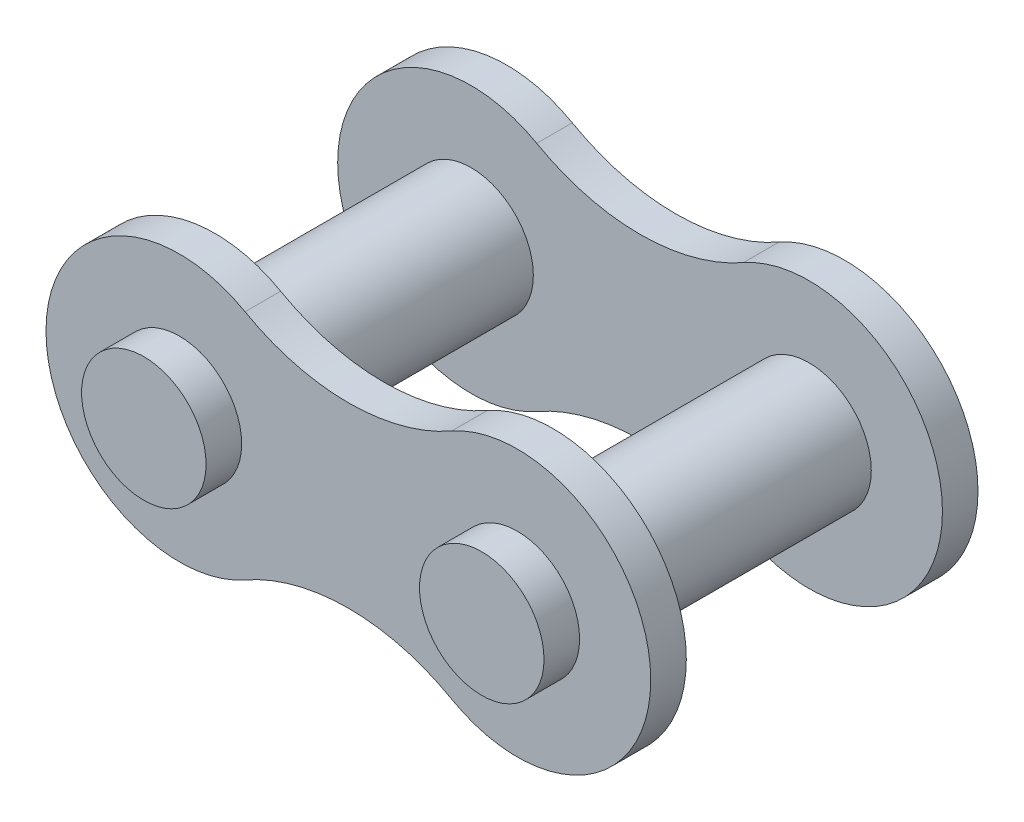
ISO-10303-21;
HEADER;
FILE_DESCRIPTION(('STEP AP214'),'2;1');
FILE_NAME('part.step','',(''),(''),'','','');
FILE_SCHEMA(('AUTOMOTIVE_DESIGN { 1 0 10303 214 1 1 1 1 }'));
ENDSEC;
DATA;
#1=APPLICATION_CONTEXT('core data for automotive mechanical design processes');
#2=APPLICATION_PROTOCOL_DEFINITION('international standard','automotive_design',2000,#1);
#3=PRODUCT_CONTEXT('',#1,'mechanical');
#4=PRODUCT('Part','Part','',(#3));
#5=PRODUCT_RELATED_PRODUCT_CATEGORY('part','',(#4));
#6=PRODUCT_DEFINITION_FORMATION('','',#4);
#7=PRODUCT_DEFINITION_CONTEXT('part definition',#1,'design');
#8=PRODUCT_DEFINITION('design','',#6,#7);
#9=PRODUCT_DEFINITION_SHAPE('','',#8);
#10=(LENGTH_UNIT() NAMED_UNIT(*) SI_UNIT(.MILLI.,.METRE.));
#11=(NAMED_UNIT(*) PLANE_ANGLE_UNIT() SI_UNIT($,.RADIAN.));
#12=(NAMED_UNIT(*) SI_UNIT($,.STERADIAN.) SOLID_ANGLE_UNIT());
#13=UNCERTAINTY_MEASURE_WITH_UNIT(LENGTH_MEASURE(1.E-05),#10,'distance_accuracy_value','');
#14=(GEOMETRIC_REPRESENTATION_CONTEXT(3) GLOBAL_UNCERTAINTY_ASSIGNED_CONTEXT((#13)) GLOBAL_UNIT_ASSIGNED_CONTEXT((#10,
#11,#12)) REPRESENTATION_CONTEXT('',''));
#15=CARTESIAN_POINT('',(0.,0.,0.));
#16=DIRECTION('',(0.,0.,1.));
#17=DIRECTION('',(1.,0.,0.));
#18=AXIS2_PLACEMENT_3D('',#15,#16,#17);
#19=CARTESIAN_POINT('',(4.75,8.4,1.));
#20=DIRECTION('',(0.,0.,-1.));
#21=DIRECTION('',(-1.,0.,0.));
#22=AXIS2_PLACEMENT_3D('',#19,#20,#21);
#23=CYLINDRICAL_SURFACE('',#22,5.9);
#24=CARTESIAN_POINT('',(4.75,8.4,0.));
#25=DIRECTION('',(0.,0.,-1.));
#26=DIRECTION('',(1.,0.,0.));
#27=AXIS2_PLACEMENT_3D('',#24,#25,#26);
#28=CIRCLE('',#27,5.9);
#29=CARTESIAN_POINT('',(7.65414507772021,3.26424870466322,0.));
#30=VERTEX_POINT('',#29);
#31=CARTESIAN_POINT('',(1.84585492227979,3.26424870466322,0.));
#32=VERTEX_POINT('',#31);
#33=EDGE_CURVE('E131',#30,#32,#28,.T.);
#34=ORIENTED_EDGE('',*,*,#33,.T.);
#35=DIRECTION('',(0.,0.,-1.));
#36=VECTOR('',#35,1.);
#37=CARTESIAN_POINT('',(1.84585492227979,3.26424870466322,1.));
#38=LINE('',#37,#36);
#39=CARTESIAN_POINT('',(1.84585492227979,3.26424870466322,1.));
#40=VERTEX_POINT('',#39);
#41=EDGE_CURVE('E152',#40,#32,#38,.T.);
#42=ORIENTED_EDGE('',*,*,#41,.F.);
#43=CARTESIAN_POINT('',(4.75,8.4,1.));
#44=DIRECTION('',(0.,0.,-1.));
#45=DIRECTION('',(1.,0.,0.));
#46=AXIS2_PLACEMENT_3D('',#43,#44,#45);
#47=CIRCLE('',#46,5.9);
#48=CARTESIAN_POINT('',(7.65414507772021,3.26424870466322,1.));
#49=VERTEX_POINT('',#48);
#50=EDGE_CURVE('E134',#49,#40,#47,.T.);
#51=ORIENTED_EDGE('',*,*,#50,.F.);
#52=DIRECTION('',(0.,0.,-1.));
#53=VECTOR('',#52,1.);
#54=CARTESIAN_POINT('',(7.65414507772021,3.26424870466322,1.));
#55=LINE('',#54,#53);
#56=EDGE_CURVE('E140',#49,#30,#55,.T.);
#57=ORIENTED_EDGE('',*,*,#56,.T.);
#58=EDGE_LOOP('',(#34,#42,#51,#57));
#59=FACE_BOUND('',#58,.T.);
#60=ADVANCED_FACE('F16',(#59),#23,.F.);
#61=CARTESIAN_POINT('',(0.,0.,1.));
#62=DIRECTION('',(0.,0.,-1.));
#63=DIRECTION('',(-1.,0.,0.));
#64=AXIS2_PLACEMENT_3D('',#61,#62,#63);
#65=CYLINDRICAL_SURFACE('',#64,3.75);
#66=CARTESIAN_POINT('',(0.,0.,0.));
#67=DIRECTION('',(0.,0.,1.));
#68=DIRECTION('',(1.,0.,0.));
#69=AXIS2_PLACEMENT_3D('',#66,#67,#68);
#70=CIRCLE('',#69,3.75);
#71=CARTESIAN_POINT('',(1.84585492227979,-3.26424870466322,0.));
#72=VERTEX_POINT('',#71);
#73=EDGE_CURVE('E143',#32,#72,#70,.T.);
#74=ORIENTED_EDGE('',*,*,#73,.T.);
#75=DIRECTION('',(0.,0.,-1.));
#76=VECTOR('',#75,1.);
#77=CARTESIAN_POINT('',(1.84585492227979,-3.26424870466322,1.));
#78=LINE('',#77,#76);
#79=CARTESIAN_POINT('',(1.84585492227979,-3.26424870466322,1.));
#80=VERTEX_POINT('',#79);
#81=EDGE_CURVE('E150',#80,#72,#78,.T.);
#82=ORIENTED_EDGE('',*,*,#81,.F.);
#83=CARTESIAN_POINT('',(0.,0.,1.));
#84=DIRECTION('',(0.,0.,1.));
#85=DIRECTION('',(1.,0.,0.));
#86=AXIS2_PLACEMENT_3D('',#83,#84,#85);
#87=CIRCLE('',#86,3.75);
#88=EDGE_CURVE('E64',#40,#80,#87,.T.);
#89=ORIENTED_EDGE('',*,*,#88,.F.);
#90=ORIENTED_EDGE('',*,*,#41,.T.);
#91=EDGE_LOOP('',(#74,#82,#89,#90));
#92=FACE_BOUND('',#91,.T.);
#93=ADVANCED_FACE('F172',(#92),#65,.T.);
#94=CARTESIAN_POINT('',(4.75,-8.4,1.));
#95=DIRECTION('',(0.,0.,-1.));
#96=DIRECTION('',(-1.,0.,0.));
#97=AXIS2_PLACEMENT_3D('',#94,#95,#96);
#98=CYLINDRICAL_SURFACE('',#97,5.9);
#99=CARTESIAN_POINT('',(4.75,-8.4,0.));
#100=DIRECTION('',(0.,0.,-1.));
#101=DIRECTION('',(-1.,0.,0.));
#102=AXIS2_PLACEMENT_3D('',#99,#100,#101);
#103=CIRCLE('',#102,5.9);
#104=CARTESIAN_POINT('',(7.65414507772021,-3.26424870466322,0.));
#105=VERTEX_POINT('',#104);
#106=EDGE_CURVE('E50',#72,#105,#103,.T.);
#107=ORIENTED_EDGE('',*,*,#106,.T.);
#108=DIRECTION('',(0.,0.,-1.));
#109=VECTOR('',#108,1.);
#110=CARTESIAN_POINT('',(7.65414507772021,-3.26424870466322,1.));
#111=LINE('',#110,#109);
#112=CARTESIAN_POINT('',(7.65414507772021,-3.26424870466322,1.));
#113=VERTEX_POINT('',#112);
#114=EDGE_CURVE('E148',#113,#105,#111,.T.);
#115=ORIENTED_EDGE('',*,*,#114,.F.);
#116=CARTESIAN_POINT('',(4.75,-8.4,1.));
#117=DIRECTION('',(0.,0.,-1.));
#118=DIRECTION('',(-1.,0.,0.));
#119=AXIS2_PLACEMENT_3D('',#116,#117,#118);
#120=CIRCLE('',#119,5.9);
#121=EDGE_CURVE('E137',#80,#113,#120,.T.);
#122=ORIENTED_EDGE('',*,*,#121,.F.);
#123=ORIENTED_EDGE('',*,*,#81,.T.);
#124=EDGE_LOOP('',(#107,#115,#122,#123));
#125=FACE_BOUND('',#124,.T.);
#126=ADVANCED_FACE('F171',(#125),#98,.F.);
#127=CARTESIAN_POINT('',(9.5,0.,1.));
#128=DIRECTION('',(0.,0.,-1.));
#129=DIRECTION('',(-1.,0.,0.));
#130=AXIS2_PLACEMENT_3D('',#127,#128,#129);
#131=CYLINDRICAL_SURFACE('',#130,3.75);
#132=CARTESIAN_POINT('',(9.5,0.,0.));
#133=DIRECTION('',(0.,0.,1.));
#134=DIRECTION('',(1.,0.,0.));
#135=AXIS2_PLACEMENT_3D('',#132,#133,#134);
#136=CIRCLE('',#135,3.75);
#137=EDGE_CURVE('E56',#105,#30,#136,.T.);
#138=ORIENTED_EDGE('',*,*,#137,.T.);
#139=ORIENTED_EDGE('',*,*,#56,.F.);
#140=CARTESIAN_POINT('',(9.5,0.,1.));
#141=DIRECTION('',(0.,0.,1.));
#142=DIRECTION('',(1.,0.,0.));
#143=AXIS2_PLACEMENT_3D('',#140,#141,#142);
#144=CIRCLE('',#143,3.75);
#145=EDGE_CURVE('E32',#113,#49,#144,.T.);
#146=ORIENTED_EDGE('',*,*,#145,.F.);
#147=ORIENTED_EDGE('',*,*,#114,.T.);
#148=EDGE_LOOP('',(#138,#139,#146,#147));
#149=FACE_BOUND('',#148,.T.);
#150=ADVANCED_FACE('F169',(#149),#131,.T.);
#151=CARTESIAN_POINT('',(7.125,4.2,1.));
#152=DIRECTION('',(0.,0.,1.));
#153=DIRECTION('',(1.,0.,0.));
#154=AXIS2_PLACEMENT_3D('',#151,#152,#153);
#155=PLANE('',#154);
#156=CARTESIAN_POINT('',(9.5,0.,1.));
#157=DIRECTION('',(0.,0.,1.));
#158=DIRECTION('',(1.,0.,0.));
#159=AXIS2_PLACEMENT_3D('',#156,#157,#158);
#160=CIRCLE('',#159,1.75);
#161=CARTESIAN_POINT('',(11.25,0.,1.));
#162=VERTEX_POINT('',#161);
#163=EDGE_CURVE('E116',#162,#162,#160,.T.);
#164=ORIENTED_EDGE('',*,*,#163,.F.);
#165=EDGE_LOOP('',(#164));
#166=FACE_BOUND('',#165,.T.);
#167=CARTESIAN_POINT('',(0.,0.,1.));
#168=DIRECTION('',(0.,0.,1.));
#169=DIRECTION('',(1.,0.,0.));
#170=AXIS2_PLACEMENT_3D('',#167,#168,#169);
#171=CIRCLE('',#170,1.75);
#172=CARTESIAN_POINT('',(1.75,0.,1.));
#173=VERTEX_POINT('',#172);
#174=EDGE_CURVE('E126',#173,#173,#171,.T.);
#175=ORIENTED_EDGE('',*,*,#174,.F.);
#176=EDGE_LOOP('',(#175));
#177=FACE_BOUND('',#176,.T.);
#178=ORIENTED_EDGE('',*,*,#50,.T.);
#179=ORIENTED_EDGE('',*,*,#88,.T.);
#180=ORIENTED_EDGE('',*,*,#121,.T.);
#181=ORIENTED_EDGE('',*,*,#145,.T.);
#182=EDGE_LOOP('',(#178,#179,#180,#181));
#183=FACE_BOUND('',#182,.T.);
#184=ADVANCED_FACE('F162',(#166,#177,#183),#155,.T.);
#185=CARTESIAN_POINT('',(7.125,4.2,0.));
#186=DIRECTION('',(0.,0.,1.));
#187=DIRECTION('',(1.,0.,0.));
#188=AXIS2_PLACEMENT_3D('',#185,#186,#187);
#189=PLANE('',#188);
#190=CARTESIAN_POINT('',(0.,0.,0.));
#191=DIRECTION('',(0.,0.,1.));
#192=DIRECTION('',(1.,0.,0.));
#193=AXIS2_PLACEMENT_3D('',#190,#191,#192);
#194=CIRCLE('',#193,1.75);
#195=CARTESIAN_POINT('',(1.75,0.,0.));
#196=VERTEX_POINT('',#195);
#197=EDGE_CURVE('E10',#196,#196,#194,.F.);
#198=ORIENTED_EDGE('',*,*,#197,.F.);
#199=EDGE_LOOP('',(#198));
#200=FACE_BOUND('',#199,.T.);
#201=CARTESIAN_POINT('',(9.5,0.,0.));
#202=DIRECTION('',(0.,0.,1.));
#203=DIRECTION('',(1.,0.,0.));
#204=AXIS2_PLACEMENT_3D('',#201,#202,#203);
#205=CIRCLE('',#204,1.75);
#206=CARTESIAN_POINT('',(11.25,0.,0.));
#207=VERTEX_POINT('',#206);
#208=EDGE_CURVE('E24',#207,#207,#205,.F.);
#209=ORIENTED_EDGE('',*,*,#208,.F.);
#210=EDGE_LOOP('',(#209));
#211=FACE_BOUND('',#210,.T.);
#212=ORIENTED_EDGE('',*,*,#33,.F.);
#213=ORIENTED_EDGE('',*,*,#137,.F.);
#214=ORIENTED_EDGE('',*,*,#106,.F.);
#215=ORIENTED_EDGE('',*,*,#73,.F.);
#216=EDGE_LOOP('',(#212,#213,#214,#215));
#217=FACE_BOUND('',#216,.T.);
#218=ADVANCED_FACE('F158',(#200,#211,#217),#189,.F.);
#219=CARTESIAN_POINT('',(0.,0.,8.2));
#220=DIRECTION('',(0.,0.,-1.));
#221=DIRECTION('',(-1.,0.,0.));
#222=AXIS2_PLACEMENT_3D('',#219,#220,#221);
#223=CYLINDRICAL_SURFACE('',#222,1.75);
#224=CARTESIAN_POINT('',(0.,0.,8.2));
#225=DIRECTION('',(0.,0.,1.));
#226=DIRECTION('',(1.,0.,0.));
#227=AXIS2_PLACEMENT_3D('',#224,#225,#226);
#228=CIRCLE('',#227,1.75);
#229=CARTESIAN_POINT('',(1.75,0.,8.2));
#230=VERTEX_POINT('',#229);
#231=EDGE_CURVE('E128',#230,#230,#228,.T.);
#232=ORIENTED_EDGE('',*,*,#231,.F.);
#233=EDGE_LOOP('',(#232));
#234=FACE_BOUND('',#233,.T.);
#235=ORIENTED_EDGE('',*,*,#174,.T.);
#236=EDGE_LOOP('',(#235));
#237=FACE_BOUND('',#236,.T.);
#238=ADVANCED_FACE('F161',(#234,#237),#223,.T.);
#239=CARTESIAN_POINT('',(9.5,0.,8.2));
#240=DIRECTION('',(0.,0.,-1.));
#241=DIRECTION('',(-1.,0.,0.));
#242=AXIS2_PLACEMENT_3D('',#239,#240,#241);
#243=CYLINDRICAL_SURFACE('',#242,1.75);
#244=CARTESIAN_POINT('',(9.5,0.,8.2));
#245=DIRECTION('',(0.,0.,1.));
#246=DIRECTION('',(1.,0.,0.));
#247=AXIS2_PLACEMENT_3D('',#244,#245,#246);
#248=CIRCLE('',#247,1.75);
#249=CARTESIAN_POINT('',(11.25,0.,8.2));
#250=VERTEX_POINT('',#249);
#251=EDGE_CURVE('E119',#250,#250,#248,.T.);
#252=ORIENTED_EDGE('',*,*,#251,.F.);
#253=EDGE_LOOP('',(#252));
#254=FACE_BOUND('',#253,.T.);
#255=ORIENTED_EDGE('',*,*,#163,.T.);
#256=EDGE_LOOP('',(#255));
#257=FACE_BOUND('',#256,.T.);
#258=ADVANCED_FACE('F189',(#254,#257),#243,.T.);
#259=CARTESIAN_POINT('',(0.,0.,9.2));
#260=DIRECTION('',(0.,0.,-1.));
#261=DIRECTION('',(-1.,0.,0.));
#262=AXIS2_PLACEMENT_3D('',#259,#260,#261);
#263=CYLINDRICAL_SURFACE('',#262,3.75);
#264=CARTESIAN_POINT('',(0.,0.,8.2));
#265=DIRECTION('',(0.,0.,1.));
#266=DIRECTION('',(1.,0.,0.));
#267=AXIS2_PLACEMENT_3D('',#264,#265,#266);
#268=CIRCLE('',#267,3.75);
#269=CARTESIAN_POINT('',(1.8458549222798,3.26424870466321,8.2));
#270=VERTEX_POINT('',#269);
#271=CARTESIAN_POINT('',(1.84585492227979,-3.26424870466322,8.2));
#272=VERTEX_POINT('',#271);
#273=EDGE_CURVE('E115',#270,#272,#268,.T.);
#274=ORIENTED_EDGE('',*,*,#273,.T.);
#275=DIRECTION('',(0.,0.,-1.));
#276=VECTOR('',#275,1.);
#277=CARTESIAN_POINT('',(1.84585492227979,-3.26424870466322,9.2));
#278=LINE('',#277,#276);
#279=CARTESIAN_POINT('',(1.84585492227979,-3.26424870466322,9.2));
#280=VERTEX_POINT('',#279);
#281=EDGE_CURVE('E95',#280,#272,#278,.T.);
#282=ORIENTED_EDGE('',*,*,#281,.F.);
#283=CARTESIAN_POINT('',(0.,0.,9.2));
#284=DIRECTION('',(0.,0.,1.));
#285=DIRECTION('',(1.,0.,0.));
#286=AXIS2_PLACEMENT_3D('',#283,#284,#285);
#287=CIRCLE('',#286,3.75);
#288=CARTESIAN_POINT('',(1.8458549222798,3.26424870466321,9.2));
#289=VERTEX_POINT('',#288);
#290=EDGE_CURVE('E102',#289,#280,#287,.T.);
#291=ORIENTED_EDGE('',*,*,#290,.F.);
#292=DIRECTION('',(0.,0.,-1.));
#293=VECTOR('',#292,1.);
#294=CARTESIAN_POINT('',(1.8458549222798,3.26424870466321,9.2));
#295=LINE('',#294,#293);
#296=EDGE_CURVE('E268',#289,#270,#295,.T.);
#297=ORIENTED_EDGE('',*,*,#296,.T.);
#298=EDGE_LOOP('',(#274,#282,#291,#297));
#299=FACE_BOUND('',#298,.T.);
#300=ADVANCED_FACE('F113',(#299),#263,.T.);
#301=CARTESIAN_POINT('',(4.75,-8.4,9.2));
#302=DIRECTION('',(0.,0.,-1.));
#303=DIRECTION('',(-1.,0.,0.));
#304=AXIS2_PLACEMENT_3D('',#301,#302,#303);
#305=CYLINDRICAL_SURFACE('',#304,5.9);
#306=CARTESIAN_POINT('',(4.75,-8.4,8.2));
#307=DIRECTION('',(0.,0.,-1.));
#308=DIRECTION('',(1.,0.,0.));
#309=AXIS2_PLACEMENT_3D('',#306,#307,#308);
#310=CIRCLE('',#309,5.9);
#311=CARTESIAN_POINT('',(7.65414507772021,-3.26424870466321,8.2));
#312=VERTEX_POINT('',#311);
#313=EDGE_CURVE('E270',#272,#312,#310,.T.);
#314=ORIENTED_EDGE('',*,*,#313,.T.);
#315=DIRECTION('',(0.,0.,-1.));
#316=VECTOR('',#315,1.);
#317=CARTESIAN_POINT('',(7.65414507772021,-3.26424870466321,9.2));
#318=LINE('',#317,#316);
#319=CARTESIAN_POINT('',(7.65414507772021,-3.26424870466321,9.2));
#320=VERTEX_POINT('',#319);
#321=EDGE_CURVE('E98',#320,#312,#318,.T.);
#322=ORIENTED_EDGE('',*,*,#321,.F.);
#323=CARTESIAN_POINT('',(4.75,-8.4,9.2));
#324=DIRECTION('',(0.,0.,-1.));
#325=DIRECTION('',(1.,0.,0.));
#326=AXIS2_PLACEMENT_3D('',#323,#324,#325);
#327=CIRCLE('',#326,5.9);
#328=EDGE_CURVE('E91',#280,#320,#327,.T.);
#329=ORIENTED_EDGE('',*,*,#328,.F.);
#330=ORIENTED_EDGE('',*,*,#281,.T.);
#331=EDGE_LOOP('',(#314,#322,#329,#330));
#332=FACE_BOUND('',#331,.T.);
#333=ADVANCED_FACE('F93',(#332),#305,.F.);
#334=CARTESIAN_POINT('',(9.5,0.,9.2));
#335=DIRECTION('',(0.,0.,-1.));
#336=DIRECTION('',(-1.,0.,0.));
#337=AXIS2_PLACEMENT_3D('',#334,#335,#336);
#338=CYLINDRICAL_SURFACE('',#337,3.75);
#339=CARTESIAN_POINT('',(9.5,0.,8.2));
#340=DIRECTION('',(0.,0.,1.));
#341=DIRECTION('',(1.,0.,0.));
#342=AXIS2_PLACEMENT_3D('',#339,#340,#341);
#343=CIRCLE('',#342,3.75);
#344=CARTESIAN_POINT('',(7.65414507772021,3.26424870466322,8.2));
#345=VERTEX_POINT('',#344);
#346=EDGE_CURVE('E272',#312,#345,#343,.T.);
#347=ORIENTED_EDGE('',*,*,#346,.T.);
#348=DIRECTION('',(0.,0.,-1.));
#349=VECTOR('',#348,1.);
#350=CARTESIAN_POINT('',(7.65414507772021,3.26424870466322,9.2));
#351=LINE('',#350,#349);
#352=CARTESIAN_POINT('',(7.65414507772021,3.26424870466322,9.2));
#353=VERTEX_POINT('',#352);
#354=EDGE_CURVE('E121',#353,#345,#351,.T.);
#355=ORIENTED_EDGE('',*,*,#354,.F.);
#356=CARTESIAN_POINT('',(9.5,0.,9.2));
#357=DIRECTION('',(0.,0.,1.));
#358=DIRECTION('',(1.,0.,0.));
#359=AXIS2_PLACEMENT_3D('',#356,#357,#358);
#360=CIRCLE('',#359,3.75);
#361=EDGE_CURVE('E101',#320,#353,#360,.T.);
#362=ORIENTED_EDGE('',*,*,#361,.F.);
#363=ORIENTED_EDGE('',*,*,#321,.T.);
#364=EDGE_LOOP('',(#347,#355,#362,#363));
#365=FACE_BOUND('',#364,.T.);
#366=ADVANCED_FACE('F198',(#365),#338,.T.);
#367=CARTESIAN_POINT('',(4.75,8.4,9.2));
#368=DIRECTION('',(0.,0.,-1.));
#369=DIRECTION('',(-1.,0.,0.));
#370=AXIS2_PLACEMENT_3D('',#367,#368,#369);
#371=CYLINDRICAL_SURFACE('',#370,5.9);
#372=CARTESIAN_POINT('',(4.75,8.4,8.2));
#373=DIRECTION('',(0.,0.,-1.));
#374=DIRECTION('',(1.,0.,0.));
#375=AXIS2_PLACEMENT_3D('',#372,#373,#374);
#376=CIRCLE('',#375,5.9);
#377=EDGE_CURVE('E111',#345,#270,#376,.T.);
#378=ORIENTED_EDGE('',*,*,#377,.T.);
#379=ORIENTED_EDGE('',*,*,#296,.F.);
#380=CARTESIAN_POINT('',(4.75,8.4,9.2));
#381=DIRECTION('',(0.,0.,-1.));
#382=DIRECTION('',(1.,0.,0.));
#383=AXIS2_PLACEMENT_3D('',#380,#381,#382);
#384=CIRCLE('',#383,5.9);
#385=EDGE_CURVE('E107',#353,#289,#384,.T.);
#386=ORIENTED_EDGE('',*,*,#385,.F.);
#387=ORIENTED_EDGE('',*,*,#354,.T.);
#388=EDGE_LOOP('',(#378,#379,#386,#387));
#389=FACE_BOUND('',#388,.T.);
#390=ADVANCED_FACE('F201',(#389),#371,.F.);
#391=CARTESIAN_POINT('',(2.375,-4.2,9.2));
#392=DIRECTION('',(0.,0.,1.));
#393=DIRECTION('',(1.,0.,0.));
#394=AXIS2_PLACEMENT_3D('',#391,#392,#393);
#395=PLANE('',#394);
#396=CARTESIAN_POINT('',(0.,0.,9.2));
#397=DIRECTION('',(0.,0.,1.));
#398=DIRECTION('',(1.,0.,0.));
#399=AXIS2_PLACEMENT_3D('',#396,#397,#398);
#400=CIRCLE('',#399,1.75);
#401=CARTESIAN_POINT('',(1.75,0.,9.2));
#402=VERTEX_POINT('',#401);
#403=EDGE_CURVE('E252',#402,#402,#400,.T.);
#404=ORIENTED_EDGE('',*,*,#403,.F.);
#405=EDGE_LOOP('',(#404));
#406=FACE_BOUND('',#405,.T.);
#407=CARTESIAN_POINT('',(9.5,0.,9.2));
#408=DIRECTION('',(0.,0.,1.));
#409=DIRECTION('',(1.,0.,0.));
#410=AXIS2_PLACEMENT_3D('',#407,#408,#409);
#411=CIRCLE('',#410,1.75);
#412=CARTESIAN_POINT('',(11.25,0.,9.2));
#413=VERTEX_POINT('',#412);
#414=EDGE_CURVE('E258',#413,#413,#411,.T.);
#415=ORIENTED_EDGE('',*,*,#414,.F.);
#416=EDGE_LOOP('',(#415));
#417=FACE_BOUND('',#416,.T.);
#418=ORIENTED_EDGE('',*,*,#290,.T.);
#419=ORIENTED_EDGE('',*,*,#328,.T.);
#420=ORIENTED_EDGE('',*,*,#361,.T.);
#421=ORIENTED_EDGE('',*,*,#385,.T.);
#422=EDGE_LOOP('',(#418,#419,#420,#421));
#423=FACE_BOUND('',#422,.T.);
#424=ADVANCED_FACE('F105',(#406,#417,#423),#395,.T.);
#425=CARTESIAN_POINT('',(2.375,-4.2,8.2));
#426=DIRECTION('',(0.,0.,1.));
#427=DIRECTION('',(1.,0.,0.));
#428=AXIS2_PLACEMENT_3D('',#425,#426,#427);
#429=PLANE('',#428);
#430=ORIENTED_EDGE('',*,*,#231,.T.);
#431=EDGE_LOOP('',(#430));
#432=FACE_BOUND('',#431,.T.);
#433=ORIENTED_EDGE('',*,*,#251,.T.);
#434=EDGE_LOOP('',(#433));
#435=FACE_BOUND('',#434,.T.);
#436=ORIENTED_EDGE('',*,*,#273,.F.);
#437=ORIENTED_EDGE('',*,*,#377,.F.);
#438=ORIENTED_EDGE('',*,*,#346,.F.);
#439=ORIENTED_EDGE('',*,*,#313,.F.);
#440=EDGE_LOOP('',(#436,#437,#438,#439));
#441=FACE_BOUND('',#440,.T.);
#442=ADVANCED_FACE('F206',(#432,#435,#441),#429,.F.);
#443=CARTESIAN_POINT('',(9.5,0.,10.2));
#444=DIRECTION('',(0.,0.,-1.));
#445=DIRECTION('',(-1.,0.,0.));
#446=AXIS2_PLACEMENT_3D('',#443,#444,#445);
#447=CYLINDRICAL_SURFACE('',#446,1.75);
#448=CARTESIAN_POINT('',(9.5,0.,10.2));
#449=DIRECTION('',(0.,0.,1.));
#450=DIRECTION('',(1.,0.,0.));
#451=AXIS2_PLACEMENT_3D('',#448,#449,#450);
#452=CIRCLE('',#451,1.75);
#453=CARTESIAN_POINT('',(11.25,0.,10.2));
#454=VERTEX_POINT('',#453);
#455=EDGE_CURVE('E261',#454,#454,#452,.T.);
#456=ORIENTED_EDGE('',*,*,#455,.F.);
#457=EDGE_LOOP('',(#456));
#458=FACE_BOUND('',#457,.T.);
#459=ORIENTED_EDGE('',*,*,#414,.T.);
#460=EDGE_LOOP('',(#459));
#461=FACE_BOUND('',#460,.T.);
#462=ADVANCED_FACE('F209',(#458,#461),#447,.T.);
#463=CARTESIAN_POINT('',(9.5,0.,10.2));
#464=DIRECTION('',(0.,0.,1.));
#465=DIRECTION('',(1.,0.,0.));
#466=AXIS2_PLACEMENT_3D('',#463,#464,#465);
#467=PLANE('',#466);
#468=ORIENTED_EDGE('',*,*,#455,.T.);
#469=EDGE_LOOP('',(#468));
#470=FACE_BOUND('',#469,.T.);
#471=ADVANCED_FACE('F216',(#470),#467,.T.);
#472=CARTESIAN_POINT('',(0.,0.,10.2));
#473=DIRECTION('',(0.,0.,-1.));
#474=DIRECTION('',(-1.,0.,0.));
#475=AXIS2_PLACEMENT_3D('',#472,#473,#474);
#476=CYLINDRICAL_SURFACE('',#475,1.75);
#477=CARTESIAN_POINT('',(0.,0.,10.2));
#478=DIRECTION('',(0.,0.,1.));
#479=DIRECTION('',(1.,0.,0.));
#480=AXIS2_PLACEMENT_3D('',#477,#478,#479);
#481=CIRCLE('',#480,1.75);
#482=CARTESIAN_POINT('',(1.75,0.,10.2));
#483=VERTEX_POINT('',#482);
#484=EDGE_CURVE('E255',#483,#483,#481,.T.);
#485=ORIENTED_EDGE('',*,*,#484,.F.);
#486=EDGE_LOOP('',(#485));
#487=FACE_BOUND('',#486,.T.);
#488=ORIENTED_EDGE('',*,*,#403,.T.);
#489=EDGE_LOOP('',(#488));
#490=FACE_BOUND('',#489,.T.);
#491=ADVANCED_FACE('F220',(#487,#490),#476,.T.);
#492=CARTESIAN_POINT('',(0.,0.,10.2));
#493=DIRECTION('',(0.,0.,1.));
#494=DIRECTION('',(1.,0.,0.));
#495=AXIS2_PLACEMENT_3D('',#492,#493,#494);
#496=PLANE('',#495);
#497=ORIENTED_EDGE('',*,*,#484,.T.);
#498=EDGE_LOOP('',(#497));
#499=FACE_BOUND('',#498,.T.);
#500=ADVANCED_FACE('F224',(#499),#496,.T.);
#501=CARTESIAN_POINT('',(9.5,0.,-1.));
#502=DIRECTION('',(0.,0.,1.));
#503=DIRECTION('',(1.,0.,0.));
#504=AXIS2_PLACEMENT_3D('',#501,#502,#503);
#505=CYLINDRICAL_SURFACE('',#504,1.75);
#506=CARTESIAN_POINT('',(9.5,0.,-1.));
#507=DIRECTION('',(0.,0.,-1.));
#508=DIRECTION('',(-1.,0.,0.));
#509=AXIS2_PLACEMENT_3D('',#506,#507,#508);
#510=CIRCLE('',#509,1.75);
#511=CARTESIAN_POINT('',(7.75,0.,-1.));
#512=VERTEX_POINT('',#511);
#513=EDGE_CURVE('E249',#512,#512,#510,.T.);
#514=ORIENTED_EDGE('',*,*,#513,.F.);
#515=EDGE_LOOP('',(#514));
#516=FACE_BOUND('',#515,.T.);
#517=ORIENTED_EDGE('',*,*,#208,.T.);
#518=EDGE_LOOP('',(#517));
#519=FACE_BOUND('',#518,.T.);
#520=ADVANCED_FACE('F156',(#516,#519),#505,.T.);
#521=CARTESIAN_POINT('',(9.5,0.,-1.));
#522=DIRECTION('',(0.,0.,-1.));
#523=DIRECTION('',(-1.,0.,0.));
#524=AXIS2_PLACEMENT_3D('',#521,#522,#523);
#525=PLANE('',#524);
#526=ORIENTED_EDGE('',*,*,#513,.T.);
#527=EDGE_LOOP('',(#526));
#528=FACE_BOUND('',#527,.T.);
#529=ADVANCED_FACE('F231',(#528),#525,.T.);
#530=CARTESIAN_POINT('',(0.,0.,-1.));
#531=DIRECTION('',(0.,0.,1.));
#532=DIRECTION('',(1.,0.,0.));
#533=AXIS2_PLACEMENT_3D('',#530,#531,#532);
#534=CYLINDRICAL_SURFACE('',#533,1.75);
#535=CARTESIAN_POINT('',(0.,0.,-1.));
#536=DIRECTION('',(0.,0.,-1.));
#537=DIRECTION('',(-1.,0.,0.));
#538=AXIS2_PLACEMENT_3D('',#535,#536,#537);
#539=CIRCLE('',#538,1.75);
#540=CARTESIAN_POINT('',(-1.75,0.,-1.));
#541=VERTEX_POINT('',#540);
#542=EDGE_CURVE('E248',#541,#541,#539,.T.);
#543=ORIENTED_EDGE('',*,*,#542,.F.);
#544=EDGE_LOOP('',(#543));
#545=FACE_BOUND('',#544,.T.);
#546=ORIENTED_EDGE('',*,*,#197,.T.);
#547=EDGE_LOOP('',(#546));
#548=FACE_BOUND('',#547,.T.);
#549=ADVANCED_FACE('F235',(#545,#548),#534,.T.);
#550=CARTESIAN_POINT('',(0.,0.,-1.));
#551=DIRECTION('',(0.,0.,-1.));
#552=DIRECTION('',(-1.,0.,0.));
#553=AXIS2_PLACEMENT_3D('',#550,#551,#552);
#554=PLANE('',#553);
#555=ORIENTED_EDGE('',*,*,#542,.T.);
#556=EDGE_LOOP('',(#555));
#557=FACE_BOUND('',#556,.T.);
#558=ADVANCED_FACE('F239',(#557),#554,.T.);
#559=CLOSED_SHELL('',(#60,#93,#126,#150,#184,#218,#238,#258,#300,#333,#366,#390,#424,#442,#462,
#471,#491,#500,#520,#529,#549,#558));
#560=MANIFOLD_SOLID_BREP('B1',#559);
#561=ADVANCED_BREP_SHAPE_REPRESENTATION('',(#18,#560),#14);
#562=SHAPE_DEFINITION_REPRESENTATION(#9,#561);
ENDSEC;
END-ISO-10303-21;
